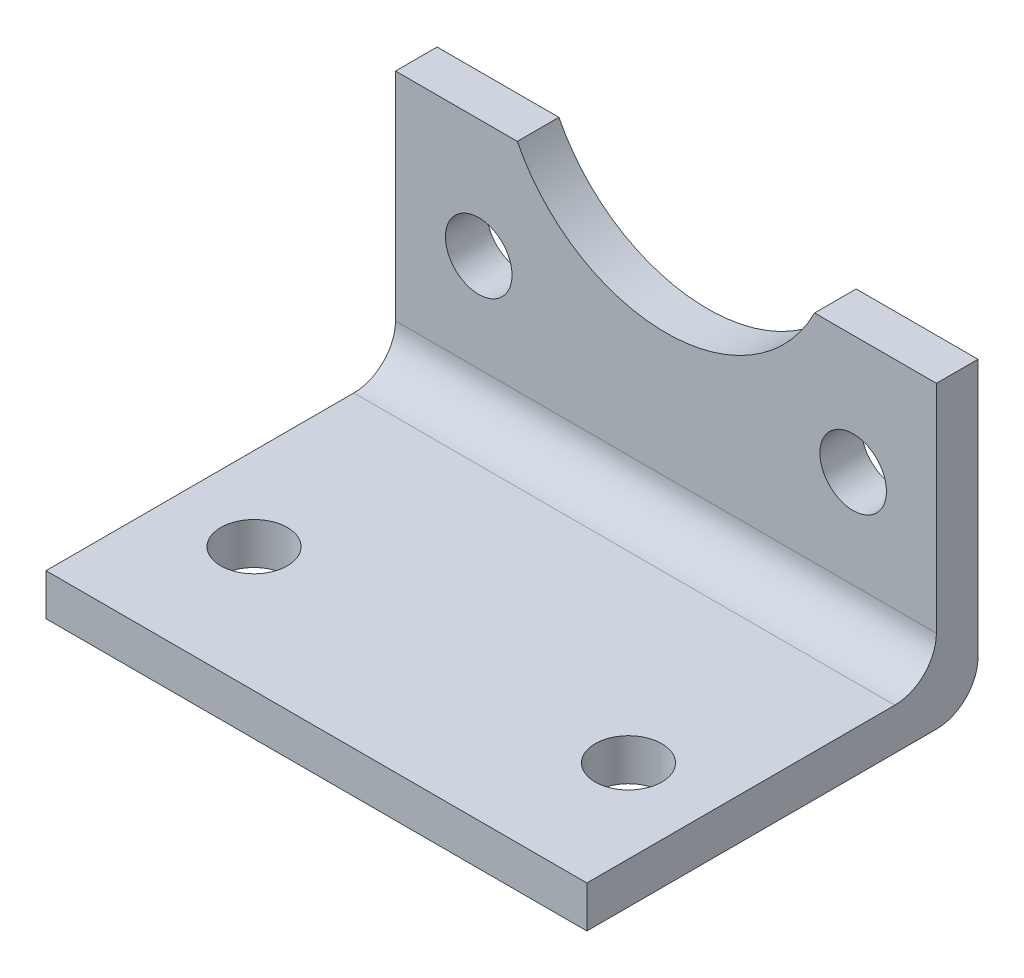
ISO-10303-21;
HEADER;
FILE_DESCRIPTION(('STEP AP214'),'2;1');
FILE_NAME('part.step','',(''),(''),'','','');
FILE_SCHEMA(('AUTOMOTIVE_DESIGN { 1 0 10303 214 1 1 1 1 }'));
ENDSEC;
DATA;
#1=APPLICATION_CONTEXT('core data for automotive mechanical design processes');
#2=APPLICATION_PROTOCOL_DEFINITION('international standard','automotive_design',2000,#1);
#3=PRODUCT_CONTEXT('',#1,'mechanical');
#4=PRODUCT('Part','Part','',(#3));
#5=PRODUCT_RELATED_PRODUCT_CATEGORY('part','',(#4));
#6=PRODUCT_DEFINITION_FORMATION('','',#4);
#7=PRODUCT_DEFINITION_CONTEXT('part definition',#1,'design');
#8=PRODUCT_DEFINITION('design','',#6,#7);
#9=PRODUCT_DEFINITION_SHAPE('','',#8);
#10=(LENGTH_UNIT() NAMED_UNIT(*) SI_UNIT(.MILLI.,.METRE.));
#11=(NAMED_UNIT(*) PLANE_ANGLE_UNIT() SI_UNIT($,.RADIAN.));
#12=(NAMED_UNIT(*) SI_UNIT($,.STERADIAN.) SOLID_ANGLE_UNIT());
#13=UNCERTAINTY_MEASURE_WITH_UNIT(LENGTH_MEASURE(1.E-05),#10,'distance_accuracy_value','');
#14=(GEOMETRIC_REPRESENTATION_CONTEXT(3) GLOBAL_UNCERTAINTY_ASSIGNED_CONTEXT((#13)) GLOBAL_UNIT_ASSIGNED_CONTEXT((#10,
#11,#12)) REPRESENTATION_CONTEXT('',''));
#15=CARTESIAN_POINT('',(0.,0.,0.));
#16=DIRECTION('',(0.,0.,1.));
#17=DIRECTION('',(1.,0.,0.));
#18=AXIS2_PLACEMENT_3D('',#15,#16,#17);
#19=CARTESIAN_POINT('',(32.5,18.,-5.));
#20=DIRECTION('',(1.,0.,0.));
#21=DIRECTION('',(0.,1.,0.));
#22=AXIS2_PLACEMENT_3D('',#19,#20,#21);
#23=PLANE('',#22);
#24=DIRECTION('',(0.,0.,1.));
#25=VECTOR('',#24,1.);
#26=CARTESIAN_POINT('',(32.5,-18.,-5.));
#27=LINE('',#26,#25);
#28=CARTESIAN_POINT('',(32.5,-18.,0.));
#29=VERTEX_POINT('',#28);
#30=CARTESIAN_POINT('',(32.5,-18.,42.));
#31=VERTEX_POINT('',#30);
#32=EDGE_CURVE('E205',#29,#31,#27,.T.);
#33=ORIENTED_EDGE('',*,*,#32,.F.);
#34=CARTESIAN_POINT('',(32.5,-13.,0.));
#35=DIRECTION('',(1.,0.,0.));
#36=DIRECTION('',(0.,1.,0.));
#37=AXIS2_PLACEMENT_3D('',#34,#35,#36);
#38=CIRCLE('',#37,5.);
#39=CARTESIAN_POINT('',(32.5,-13.,-5.));
#40=VERTEX_POINT('',#39);
#41=EDGE_CURVE('E62',#29,#40,#38,.T.);
#42=ORIENTED_EDGE('',*,*,#41,.T.);
#43=DIRECTION('',(0.,1.,0.));
#44=VECTOR('',#43,1.);
#45=CARTESIAN_POINT('',(32.5,18.,-5.));
#46=LINE('',#45,#44);
#47=CARTESIAN_POINT('',(32.5,18.,-5.));
#48=VERTEX_POINT('',#47);
#49=EDGE_CURVE('E168',#40,#48,#46,.T.);
#50=ORIENTED_EDGE('',*,*,#49,.T.);
#51=DIRECTION('',(0.,0.,1.));
#52=VECTOR('',#51,1.);
#53=CARTESIAN_POINT('',(32.5,18.,-5.));
#54=LINE('',#53,#52);
#55=CARTESIAN_POINT('',(32.5,18.,0.));
#56=VERTEX_POINT('',#55);
#57=EDGE_CURVE('E187',#48,#56,#54,.T.);
#58=ORIENTED_EDGE('',*,*,#57,.T.);
#59=DIRECTION('',(0.,1.,0.));
#60=VECTOR('',#59,1.);
#61=CARTESIAN_POINT('',(32.5,18.,0.));
#62=LINE('',#61,#60);
#63=CARTESIAN_POINT('',(32.5,-8.,0.));
#64=VERTEX_POINT('',#63);
#65=EDGE_CURVE('E164',#64,#56,#62,.T.);
#66=ORIENTED_EDGE('',*,*,#65,.F.);
#67=CARTESIAN_POINT('',(32.5,-8.,5.));
#68=DIRECTION('',(1.,0.,0.));
#69=DIRECTION('',(0.,1.,0.));
#70=AXIS2_PLACEMENT_3D('',#67,#68,#69);
#71=CIRCLE('',#70,5.);
#72=CARTESIAN_POINT('',(32.5,-13.,5.));
#73=VERTEX_POINT('',#72);
#74=EDGE_CURVE('E121',#64,#73,#71,.F.);
#75=ORIENTED_EDGE('',*,*,#74,.T.);
#76=DIRECTION('',(0.,0.,1.));
#77=VECTOR('',#76,1.);
#78=CARTESIAN_POINT('',(32.5,-13.,-5.));
#79=LINE('',#78,#77);
#80=CARTESIAN_POINT('',(32.5,-13.,42.));
#81=VERTEX_POINT('',#80);
#82=EDGE_CURVE('E115',#73,#81,#79,.T.);
#83=ORIENTED_EDGE('',*,*,#82,.T.);
#84=DIRECTION('',(0.,-1.,0.));
#85=VECTOR('',#84,1.);
#86=CARTESIAN_POINT('',(32.5,-13.,42.));
#87=LINE('',#86,#85);
#88=EDGE_CURVE('E117',#81,#31,#87,.T.);
#89=ORIENTED_EDGE('',*,*,#88,.T.);
#90=EDGE_LOOP('',(#33,#42,#50,#58,#66,#75,#83,#89));
#91=FACE_BOUND('',#90,.T.);
#92=ADVANCED_FACE('F39',(#91),#23,.T.);
#93=CARTESIAN_POINT('',(-32.5,-18.,-5.));
#94=DIRECTION('',(0.,-1.,0.));
#95=DIRECTION('',(0.,0.,-1.));
#96=AXIS2_PLACEMENT_3D('',#93,#94,#95);
#97=PLANE('',#96);
#98=DIRECTION('',(0.,0.,1.));
#99=VECTOR('',#98,1.);
#100=CARTESIAN_POINT('',(-32.5,-18.,-5.));
#101=LINE('',#100,#99);
#102=CARTESIAN_POINT('',(-32.5,-18.,0.));
#103=VERTEX_POINT('',#102);
#104=CARTESIAN_POINT('',(-32.5,-18.,42.));
#105=VERTEX_POINT('',#104);
#106=EDGE_CURVE('E209',#103,#105,#101,.T.);
#107=ORIENTED_EDGE('',*,*,#106,.F.);
#108=DIRECTION('',(1.,0.,0.));
#109=VECTOR('',#108,1.);
#110=CARTESIAN_POINT('',(32.5,-18.,0.));
#111=LINE('',#110,#109);
#112=EDGE_CURVE('E234',#103,#29,#111,.T.);
#113=ORIENTED_EDGE('',*,*,#112,.T.);
#114=ORIENTED_EDGE('',*,*,#32,.T.);
#115=DIRECTION('',(-1.,0.,0.));
#116=VECTOR('',#115,1.);
#117=CARTESIAN_POINT('',(-32.5,-18.,42.));
#118=LINE('',#117,#116);
#119=EDGE_CURVE('E135',#31,#105,#118,.T.);
#120=ORIENTED_EDGE('',*,*,#119,.T.);
#121=EDGE_LOOP('',(#107,#113,#114,#120));
#122=FACE_BOUND('',#121,.T.);
#123=CARTESIAN_POINT('',(22.5,-18.,27.));
#124=DIRECTION('',(0.,-1.,0.));
#125=DIRECTION('',(0.,0.,1.));
#126=AXIS2_PLACEMENT_3D('',#123,#124,#125);
#127=CIRCLE('',#126,4.);
#128=CARTESIAN_POINT('',(22.5,-18.,31.));
#129=VERTEX_POINT('',#128);
#130=EDGE_CURVE('E278',#129,#129,#127,.T.);
#131=ORIENTED_EDGE('',*,*,#130,.F.);
#132=EDGE_LOOP('',(#131));
#133=FACE_BOUND('',#132,.T.);
#134=CARTESIAN_POINT('',(-22.5,-18.,27.));
#135=DIRECTION('',(0.,-1.,0.));
#136=DIRECTION('',(0.,0.,-1.));
#137=AXIS2_PLACEMENT_3D('',#134,#135,#136);
#138=CIRCLE('',#137,4.);
#139=CARTESIAN_POINT('',(-22.5,-18.,23.));
#140=VERTEX_POINT('',#139);
#141=EDGE_CURVE('E270',#140,#140,#138,.T.);
#142=ORIENTED_EDGE('',*,*,#141,.F.);
#143=EDGE_LOOP('',(#142));
#144=FACE_BOUND('',#143,.T.);
#145=ADVANCED_FACE('F243',(#122,#133,#144),#97,.T.);
#146=CARTESIAN_POINT('',(-32.5,18.,-5.));
#147=DIRECTION('',(-1.,0.,0.));
#148=DIRECTION('',(0.,-1.,0.));
#149=AXIS2_PLACEMENT_3D('',#146,#147,#148);
#150=PLANE('',#149);
#151=DIRECTION('',(0.,-1.,0.));
#152=VECTOR('',#151,1.);
#153=CARTESIAN_POINT('',(-32.5,18.,-5.));
#154=LINE('',#153,#152);
#155=CARTESIAN_POINT('',(-32.5,18.,-5.));
#156=VERTEX_POINT('',#155);
#157=CARTESIAN_POINT('',(-32.5,-13.,-5.));
#158=VERTEX_POINT('',#157);
#159=EDGE_CURVE('E184',#156,#158,#154,.T.);
#160=ORIENTED_EDGE('',*,*,#159,.T.);
#161=CARTESIAN_POINT('',(-32.5,-13.,0.));
#162=DIRECTION('',(-1.,0.,0.));
#163=DIRECTION('',(0.,-1.,0.));
#164=AXIS2_PLACEMENT_3D('',#161,#162,#163);
#165=CIRCLE('',#164,5.);
#166=EDGE_CURVE('E11',#158,#103,#165,.T.);
#167=ORIENTED_EDGE('',*,*,#166,.T.);
#168=ORIENTED_EDGE('',*,*,#106,.T.);
#169=DIRECTION('',(0.,-1.,0.));
#170=VECTOR('',#169,1.);
#171=CARTESIAN_POINT('',(-32.5,-13.,42.));
#172=LINE('',#171,#170);
#173=CARTESIAN_POINT('',(-32.5,-13.,42.));
#174=VERTEX_POINT('',#173);
#175=EDGE_CURVE('E137',#174,#105,#172,.T.);
#176=ORIENTED_EDGE('',*,*,#175,.F.);
#177=DIRECTION('',(0.,0.,-1.));
#178=VECTOR('',#177,1.);
#179=CARTESIAN_POINT('',(-32.5,-13.,-5.));
#180=LINE('',#179,#178);
#181=CARTESIAN_POINT('',(-32.5,-13.,5.));
#182=VERTEX_POINT('',#181);
#183=EDGE_CURVE('E128',#174,#182,#180,.T.);
#184=ORIENTED_EDGE('',*,*,#183,.T.);
#185=CARTESIAN_POINT('',(-32.5,-8.,5.));
#186=DIRECTION('',(-1.,0.,0.));
#187=DIRECTION('',(0.,-1.,0.));
#188=AXIS2_PLACEMENT_3D('',#185,#186,#187);
#189=CIRCLE('',#188,5.);
#190=CARTESIAN_POINT('',(-32.5,-8.,0.));
#191=VERTEX_POINT('',#190);
#192=EDGE_CURVE('E229',#182,#191,#189,.F.);
#193=ORIENTED_EDGE('',*,*,#192,.T.);
#194=DIRECTION('',(0.,-1.,0.));
#195=VECTOR('',#194,1.);
#196=CARTESIAN_POINT('',(-32.5,18.,0.));
#197=LINE('',#196,#195);
#198=CARTESIAN_POINT('',(-32.5,18.,0.));
#199=VERTEX_POINT('',#198);
#200=EDGE_CURVE('E172',#199,#191,#197,.T.);
#201=ORIENTED_EDGE('',*,*,#200,.F.);
#202=DIRECTION('',(0.,0.,1.));
#203=VECTOR('',#202,1.);
#204=CARTESIAN_POINT('',(-32.5,18.,-5.));
#205=LINE('',#204,#203);
#206=EDGE_CURVE('E212',#156,#199,#205,.T.);
#207=ORIENTED_EDGE('',*,*,#206,.F.);
#208=EDGE_LOOP('',(#160,#167,#168,#176,#184,#193,#201,#207));
#209=FACE_BOUND('',#208,.T.);
#210=ADVANCED_FACE('F248',(#209),#150,.T.);
#211=CARTESIAN_POINT('',(-32.5,18.,-5.));
#212=DIRECTION('',(0.,1.,0.));
#213=DIRECTION('',(0.,0.,1.));
#214=AXIS2_PLACEMENT_3D('',#211,#212,#213);
#215=PLANE('',#214);
#216=DIRECTION('',(-1.,0.,0.));
#217=VECTOR('',#216,1.);
#218=CARTESIAN_POINT('',(-32.5,18.,0.));
#219=LINE('',#218,#217);
#220=CARTESIAN_POINT('',(-17.8605710994918,18.,0.));
#221=VERTEX_POINT('',#220);
#222=EDGE_CURVE('E198',#221,#199,#219,.T.);
#223=ORIENTED_EDGE('',*,*,#222,.F.);
#224=DIRECTION('',(0.,0.,1.));
#225=VECTOR('',#224,1.);
#226=CARTESIAN_POINT('',(-17.8605710994918,18.,-5.));
#227=LINE('',#226,#225);
#228=CARTESIAN_POINT('',(-17.8605710994918,18.,-5.));
#229=VERTEX_POINT('',#228);
#230=EDGE_CURVE('E215',#229,#221,#227,.T.);
#231=ORIENTED_EDGE('',*,*,#230,.F.);
#232=DIRECTION('',(-1.,0.,0.));
#233=VECTOR('',#232,1.);
#234=CARTESIAN_POINT('',(-32.5,18.,-5.));
#235=LINE('',#234,#233);
#236=EDGE_CURVE('E180',#229,#156,#235,.T.);
#237=ORIENTED_EDGE('',*,*,#236,.T.);
#238=ORIENTED_EDGE('',*,*,#206,.T.);
#239=EDGE_LOOP('',(#223,#231,#237,#238));
#240=FACE_BOUND('',#239,.T.);
#241=ADVANCED_FACE('F255',(#240),#215,.T.);
#242=CARTESIAN_POINT('',(0.,27.,-5.));
#243=DIRECTION('',(0.,0.,1.));
#244=DIRECTION('',(1.,0.,0.));
#245=AXIS2_PLACEMENT_3D('',#242,#243,#244);
#246=CYLINDRICAL_SURFACE('',#245,20.);
#247=CARTESIAN_POINT('',(0.,27.,0.));
#248=DIRECTION('',(0.,0.,-1.));
#249=DIRECTION('',(1.,0.,0.));
#250=AXIS2_PLACEMENT_3D('',#247,#248,#249);
#251=CIRCLE('',#250,20.);
#252=CARTESIAN_POINT('',(17.8605710994918,18.,0.));
#253=VERTEX_POINT('',#252);
#254=EDGE_CURVE('E194',#253,#221,#251,.T.);
#255=ORIENTED_EDGE('',*,*,#254,.F.);
#256=DIRECTION('',(0.,0.,1.));
#257=VECTOR('',#256,1.);
#258=CARTESIAN_POINT('',(17.8605710994918,18.,-5.));
#259=LINE('',#258,#257);
#260=CARTESIAN_POINT('',(17.8605710994918,18.,-5.));
#261=VERTEX_POINT('',#260);
#262=EDGE_CURVE('E218',#261,#253,#259,.T.);
#263=ORIENTED_EDGE('',*,*,#262,.F.);
#264=CARTESIAN_POINT('',(0.,27.,-5.));
#265=DIRECTION('',(0.,0.,-1.));
#266=DIRECTION('',(1.,0.,0.));
#267=AXIS2_PLACEMENT_3D('',#264,#265,#266);
#268=CIRCLE('',#267,20.);
#269=EDGE_CURVE('E176',#261,#229,#268,.T.);
#270=ORIENTED_EDGE('',*,*,#269,.T.);
#271=ORIENTED_EDGE('',*,*,#230,.T.);
#272=EDGE_LOOP('',(#255,#263,#270,#271));
#273=FACE_BOUND('',#272,.T.);
#274=ADVANCED_FACE('F258',(#273),#246,.F.);
#275=CARTESIAN_POINT('',(17.8605710994918,18.,-5.));
#276=DIRECTION('',(0.,1.,0.));
#277=DIRECTION('',(0.,0.,1.));
#278=AXIS2_PLACEMENT_3D('',#275,#276,#277);
#279=PLANE('',#278);
#280=DIRECTION('',(-1.,0.,0.));
#281=VECTOR('',#280,1.);
#282=CARTESIAN_POINT('',(17.8605710994918,18.,0.));
#283=LINE('',#282,#281);
#284=EDGE_CURVE('E190',#56,#253,#283,.T.);
#285=ORIENTED_EDGE('',*,*,#284,.F.);
#286=ORIENTED_EDGE('',*,*,#57,.F.);
#287=DIRECTION('',(-1.,0.,0.));
#288=VECTOR('',#287,1.);
#289=CARTESIAN_POINT('',(17.8605710994918,18.,-5.));
#290=LINE('',#289,#288);
#291=EDGE_CURVE('E171',#48,#261,#290,.T.);
#292=ORIENTED_EDGE('',*,*,#291,.T.);
#293=ORIENTED_EDGE('',*,*,#262,.T.);
#294=EDGE_LOOP('',(#285,#286,#292,#293));
#295=FACE_BOUND('',#294,.T.);
#296=ADVANCED_FACE('F263',(#295),#279,.T.);
#297=CARTESIAN_POINT('',(0.,27.,-5.));
#298=DIRECTION('',(0.,0.,1.));
#299=DIRECTION('',(1.,0.,0.));
#300=AXIS2_PLACEMENT_3D('',#297,#298,#299);
#301=PLANE('',#300);
#302=CARTESIAN_POINT('',(22.5,3.75,-5.));
#303=DIRECTION('',(0.,0.,1.));
#304=DIRECTION('',(-1.,0.,0.));
#305=AXIS2_PLACEMENT_3D('',#302,#303,#304);
#306=CIRCLE('',#305,4.);
#307=CARTESIAN_POINT('',(18.5,3.75,-5.));
#308=VERTEX_POINT('',#307);
#309=EDGE_CURVE('E152',#308,#308,#306,.T.);
#310=ORIENTED_EDGE('',*,*,#309,.T.);
#311=EDGE_LOOP('',(#310));
#312=FACE_BOUND('',#311,.T.);
#313=CARTESIAN_POINT('',(-22.5,3.75,-5.));
#314=DIRECTION('',(0.,0.,1.));
#315=DIRECTION('',(1.,0.,0.));
#316=AXIS2_PLACEMENT_3D('',#313,#314,#315);
#317=CIRCLE('',#316,4.);
#318=CARTESIAN_POINT('',(-18.5,3.75,-5.));
#319=VERTEX_POINT('',#318);
#320=EDGE_CURVE('E160',#319,#319,#317,.T.);
#321=ORIENTED_EDGE('',*,*,#320,.T.);
#322=EDGE_LOOP('',(#321));
#323=FACE_BOUND('',#322,.T.);
#324=ORIENTED_EDGE('',*,*,#49,.F.);
#325=DIRECTION('',(1.,0.,0.));
#326=VECTOR('',#325,1.);
#327=CARTESIAN_POINT('',(-32.5,-13.,-5.));
#328=LINE('',#327,#326);
#329=EDGE_CURVE('E48',#40,#158,#328,.F.);
#330=ORIENTED_EDGE('',*,*,#329,.T.);
#331=ORIENTED_EDGE('',*,*,#159,.F.);
#332=ORIENTED_EDGE('',*,*,#236,.F.);
#333=ORIENTED_EDGE('',*,*,#269,.F.);
#334=ORIENTED_EDGE('',*,*,#291,.F.);
#335=EDGE_LOOP('',(#324,#330,#331,#332,#333,#334));
#336=FACE_BOUND('',#335,.T.);
#337=ADVANCED_FACE('F251',(#312,#323,#336),#301,.F.);
#338=CARTESIAN_POINT('',(0.,27.,0.));
#339=DIRECTION('',(0.,0.,1.));
#340=DIRECTION('',(1.,0.,0.));
#341=AXIS2_PLACEMENT_3D('',#338,#339,#340);
#342=PLANE('',#341);
#343=ORIENTED_EDGE('',*,*,#200,.T.);
#344=DIRECTION('',(-1.,0.,0.));
#345=VECTOR('',#344,1.);
#346=CARTESIAN_POINT('',(32.5,-8.,0.));
#347=LINE('',#346,#345);
#348=EDGE_CURVE('E226',#191,#64,#347,.F.);
#349=ORIENTED_EDGE('',*,*,#348,.T.);
#350=ORIENTED_EDGE('',*,*,#65,.T.);
#351=ORIENTED_EDGE('',*,*,#284,.T.);
#352=ORIENTED_EDGE('',*,*,#254,.T.);
#353=ORIENTED_EDGE('',*,*,#222,.T.);
#354=EDGE_LOOP('',(#343,#349,#350,#351,#352,#353));
#355=FACE_BOUND('',#354,.T.);
#356=CARTESIAN_POINT('',(22.5,3.75,0.));
#357=DIRECTION('',(0.,0.,1.));
#358=DIRECTION('',(-1.,0.,0.));
#359=AXIS2_PLACEMENT_3D('',#356,#357,#358);
#360=CIRCLE('',#359,4.);
#361=CARTESIAN_POINT('',(18.5,3.75,0.));
#362=VERTEX_POINT('',#361);
#363=EDGE_CURVE('E150',#362,#362,#360,.T.);
#364=ORIENTED_EDGE('',*,*,#363,.F.);
#365=EDGE_LOOP('',(#364));
#366=FACE_BOUND('',#365,.T.);
#367=CARTESIAN_POINT('',(-22.5,3.75,0.));
#368=DIRECTION('',(0.,0.,1.));
#369=DIRECTION('',(1.,0.,0.));
#370=AXIS2_PLACEMENT_3D('',#367,#368,#369);
#371=CIRCLE('',#370,4.);
#372=CARTESIAN_POINT('',(-18.5,3.75,0.));
#373=VERTEX_POINT('',#372);
#374=EDGE_CURVE('E156',#373,#373,#371,.T.);
#375=ORIENTED_EDGE('',*,*,#374,.F.);
#376=EDGE_LOOP('',(#375));
#377=FACE_BOUND('',#376,.T.);
#378=ADVANCED_FACE('F329',(#355,#366,#377),#342,.T.);
#379=CARTESIAN_POINT('',(-22.5,3.75,-5.));
#380=DIRECTION('',(0.,0.,1.));
#381=DIRECTION('',(1.,0.,0.));
#382=AXIS2_PLACEMENT_3D('',#379,#380,#381);
#383=CYLINDRICAL_SURFACE('',#382,4.);
#384=ORIENTED_EDGE('',*,*,#320,.F.);
#385=EDGE_LOOP('',(#384));
#386=FACE_BOUND('',#385,.T.);
#387=ORIENTED_EDGE('',*,*,#374,.T.);
#388=EDGE_LOOP('',(#387));
#389=FACE_BOUND('',#388,.T.);
#390=ADVANCED_FACE('F377',(#386,#389),#383,.F.);
#391=CARTESIAN_POINT('',(22.5,3.75,-5.));
#392=DIRECTION('',(0.,0.,1.));
#393=DIRECTION('',(1.,0.,0.));
#394=AXIS2_PLACEMENT_3D('',#391,#392,#393);
#395=CYLINDRICAL_SURFACE('',#394,4.);
#396=ORIENTED_EDGE('',*,*,#309,.F.);
#397=EDGE_LOOP('',(#396));
#398=FACE_BOUND('',#397,.T.);
#399=ORIENTED_EDGE('',*,*,#363,.T.);
#400=EDGE_LOOP('',(#399));
#401=FACE_BOUND('',#400,.T.);
#402=ADVANCED_FACE('F394',(#398,#401),#395,.F.);
#403=CARTESIAN_POINT('',(-32.5,-13.,42.));
#404=DIRECTION('',(0.,0.,1.));
#405=DIRECTION('',(1.,0.,0.));
#406=AXIS2_PLACEMENT_3D('',#403,#404,#405);
#407=PLANE('',#406);
#408=ORIENTED_EDGE('',*,*,#119,.F.);
#409=ORIENTED_EDGE('',*,*,#88,.F.);
#410=DIRECTION('',(-1.,0.,0.));
#411=VECTOR('',#410,1.);
#412=CARTESIAN_POINT('',(-32.5,-13.,42.));
#413=LINE('',#412,#411);
#414=EDGE_CURVE('E127',#81,#174,#413,.T.);
#415=ORIENTED_EDGE('',*,*,#414,.T.);
#416=ORIENTED_EDGE('',*,*,#175,.T.);
#417=EDGE_LOOP('',(#408,#409,#415,#416));
#418=FACE_BOUND('',#417,.T.);
#419=ADVANCED_FACE('F132',(#418),#407,.T.);
#420=CARTESIAN_POINT('',(0.,-13.,0.));
#421=DIRECTION('',(0.,1.,0.));
#422=DIRECTION('',(0.,0.,1.));
#423=AXIS2_PLACEMENT_3D('',#420,#421,#422);
#424=PLANE('',#423);
#425=CARTESIAN_POINT('',(22.5,-13.,27.));
#426=DIRECTION('',(0.,-1.,0.));
#427=DIRECTION('',(0.,0.,1.));
#428=AXIS2_PLACEMENT_3D('',#425,#426,#427);
#429=CIRCLE('',#428,4.);
#430=CARTESIAN_POINT('',(22.5,-13.,31.));
#431=VERTEX_POINT('',#430);
#432=EDGE_CURVE('E274',#431,#431,#429,.T.);
#433=ORIENTED_EDGE('',*,*,#432,.T.);
#434=EDGE_LOOP('',(#433));
#435=FACE_BOUND('',#434,.T.);
#436=CARTESIAN_POINT('',(-22.5,-13.,27.));
#437=DIRECTION('',(0.,-1.,0.));
#438=DIRECTION('',(0.,0.,-1.));
#439=AXIS2_PLACEMENT_3D('',#436,#437,#438);
#440=CIRCLE('',#439,4.);
#441=CARTESIAN_POINT('',(-22.5,-13.,23.));
#442=VERTEX_POINT('',#441);
#443=EDGE_CURVE('E148',#442,#442,#440,.T.);
#444=ORIENTED_EDGE('',*,*,#443,.T.);
#445=EDGE_LOOP('',(#444));
#446=FACE_BOUND('',#445,.T.);
#447=ORIENTED_EDGE('',*,*,#82,.F.);
#448=DIRECTION('',(-1.,0.,0.));
#449=VECTOR('',#448,1.);
#450=CARTESIAN_POINT('',(-32.5,-13.,5.));
#451=LINE('',#450,#449);
#452=EDGE_CURVE('E208',#73,#182,#451,.T.);
#453=ORIENTED_EDGE('',*,*,#452,.T.);
#454=ORIENTED_EDGE('',*,*,#183,.F.);
#455=ORIENTED_EDGE('',*,*,#414,.F.);
#456=EDGE_LOOP('',(#447,#453,#454,#455));
#457=FACE_BOUND('',#456,.T.);
#458=ADVANCED_FACE('F140',(#435,#446,#457),#424,.T.);
#459=CARTESIAN_POINT('',(-22.5,-13.,27.));
#460=DIRECTION('',(0.,-1.,0.));
#461=DIRECTION('',(0.,0.,-1.));
#462=AXIS2_PLACEMENT_3D('',#459,#460,#461);
#463=CYLINDRICAL_SURFACE('',#462,4.);
#464=ORIENTED_EDGE('',*,*,#443,.F.);
#465=EDGE_LOOP('',(#464));
#466=FACE_BOUND('',#465,.T.);
#467=ORIENTED_EDGE('',*,*,#141,.T.);
#468=EDGE_LOOP('',(#467));
#469=FACE_BOUND('',#468,.T.);
#470=ADVANCED_FACE('F291',(#466,#469),#463,.F.);
#471=CARTESIAN_POINT('',(22.5,-13.,27.));
#472=DIRECTION('',(0.,-1.,0.));
#473=DIRECTION('',(0.,0.,-1.));
#474=AXIS2_PLACEMENT_3D('',#471,#472,#473);
#475=CYLINDRICAL_SURFACE('',#474,4.);
#476=ORIENTED_EDGE('',*,*,#432,.F.);
#477=EDGE_LOOP('',(#476));
#478=FACE_BOUND('',#477,.T.);
#479=ORIENTED_EDGE('',*,*,#130,.T.);
#480=EDGE_LOOP('',(#479));
#481=FACE_BOUND('',#480,.T.);
#482=ADVANCED_FACE('F288',(#478,#481),#475,.F.);
#483=CARTESIAN_POINT('',(0.,-8.,5.));
#484=DIRECTION('',(1.,0.,0.));
#485=DIRECTION('',(0.,0.,-1.));
#486=AXIS2_PLACEMENT_3D('',#483,#484,#485);
#487=CYLINDRICAL_SURFACE('',#486,5.);
#488=ORIENTED_EDGE('',*,*,#74,.F.);
#489=ORIENTED_EDGE('',*,*,#348,.F.);
#490=ORIENTED_EDGE('',*,*,#192,.F.);
#491=ORIENTED_EDGE('',*,*,#452,.F.);
#492=EDGE_LOOP('',(#488,#489,#490,#491));
#493=FACE_BOUND('',#492,.T.);
#494=ADVANCED_FACE('F267',(#493),#487,.F.);
#495=CARTESIAN_POINT('',(-32.5,-13.,0.));
#496=DIRECTION('',(-1.,0.,0.));
#497=DIRECTION('',(0.,0.,1.));
#498=AXIS2_PLACEMENT_3D('',#495,#496,#497);
#499=CYLINDRICAL_SURFACE('',#498,5.);
#500=ORIENTED_EDGE('',*,*,#166,.F.);
#501=ORIENTED_EDGE('',*,*,#329,.F.);
#502=ORIENTED_EDGE('',*,*,#41,.F.);
#503=ORIENTED_EDGE('',*,*,#112,.F.);
#504=EDGE_LOOP('',(#500,#501,#502,#503));
#505=FACE_BOUND('',#504,.T.);
#506=ADVANCED_FACE('F41',(#505),#499,.T.);
#507=CLOSED_SHELL('',(#92,#145,#210,#241,#274,#296,#337,#378,#390,#402,#419,#458,#470,#482,#494,#506));
#508=MANIFOLD_SOLID_BREP('B2',#507);
#509=ADVANCED_BREP_SHAPE_REPRESENTATION('',(#18,#508),#14);
#510=SHAPE_DEFINITION_REPRESENTATION(#9,#509);
ENDSEC;
END-ISO-10303-21;
